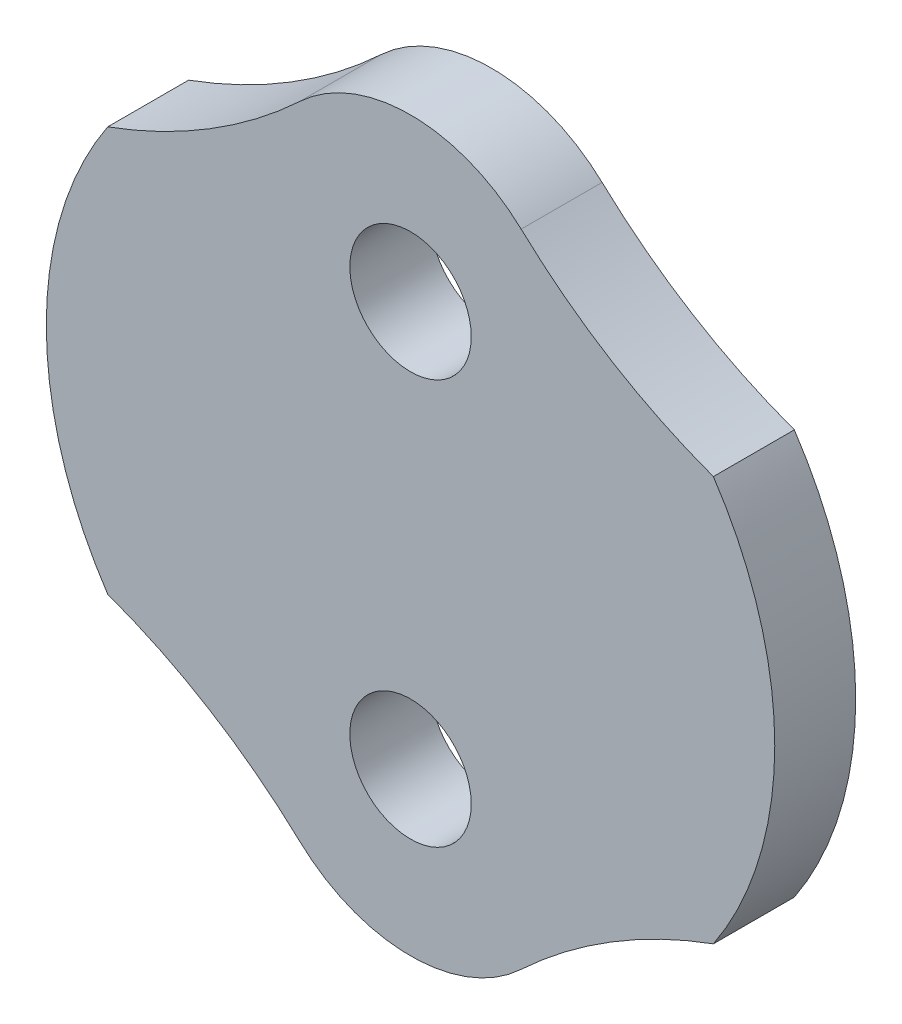
ISO-10303-21;
HEADER;
FILE_DESCRIPTION(('STEP AP214'),'2;1');
FILE_NAME('part.step','',(''),(''),'','','');
FILE_SCHEMA(('AUTOMOTIVE_DESIGN { 1 0 10303 214 1 1 1 1 }'));
ENDSEC;
DATA;
#1=APPLICATION_CONTEXT('core data for automotive mechanical design processes');
#2=APPLICATION_PROTOCOL_DEFINITION('international standard','automotive_design',2000,#1);
#3=PRODUCT_CONTEXT('',#1,'mechanical');
#4=PRODUCT('Part','Part','',(#3));
#5=PRODUCT_RELATED_PRODUCT_CATEGORY('part','',(#4));
#6=PRODUCT_DEFINITION_FORMATION('','',#4);
#7=PRODUCT_DEFINITION_CONTEXT('part definition',#1,'design');
#8=PRODUCT_DEFINITION('design','',#6,#7);
#9=PRODUCT_DEFINITION_SHAPE('','',#8);
#10=(LENGTH_UNIT() NAMED_UNIT(*) SI_UNIT(.MILLI.,.METRE.));
#11=(NAMED_UNIT(*) PLANE_ANGLE_UNIT() SI_UNIT($,.RADIAN.));
#12=(NAMED_UNIT(*) SI_UNIT($,.STERADIAN.) SOLID_ANGLE_UNIT());
#13=UNCERTAINTY_MEASURE_WITH_UNIT(LENGTH_MEASURE(1.E-05),#10,'distance_accuracy_value','');
#14=(GEOMETRIC_REPRESENTATION_CONTEXT(3) GLOBAL_UNCERTAINTY_ASSIGNED_CONTEXT((#13)) GLOBAL_UNIT_ASSIGNED_CONTEXT((#10,
#11,#12)) REPRESENTATION_CONTEXT('',''));
#15=CARTESIAN_POINT('',(0.,0.,0.));
#16=DIRECTION('',(0.,0.,1.));
#17=DIRECTION('',(1.,0.,0.));
#18=AXIS2_PLACEMENT_3D('',#15,#16,#17);
#19=CARTESIAN_POINT('',(0.,0.,3.175));
#20=DIRECTION('',(0.,0.,1.));
#21=DIRECTION('',(1.,0.,0.));
#22=AXIS2_PLACEMENT_3D('',#19,#20,#21);
#23=PLANE('',#22);
#24=CARTESIAN_POINT('',(0.,-7.9375,3.175));
#25=DIRECTION('',(0.,0.,1.));
#26=DIRECTION('',(1.,0.,0.));
#27=AXIS2_PLACEMENT_3D('',#24,#25,#26);
#28=CIRCLE('',#27,2.38125);
#29=CARTESIAN_POINT('',(2.38125,-7.9375,3.175));
#30=VERTEX_POINT('',#29);
#31=EDGE_CURVE('E159',#30,#30,#28,.T.);
#32=ORIENTED_EDGE('',*,*,#31,.F.);
#33=EDGE_LOOP('',(#32));
#34=FACE_BOUND('',#33,.T.);
#35=CARTESIAN_POINT('',(0.,7.9375,3.175));
#36=DIRECTION('',(0.,0.,1.));
#37=DIRECTION('',(1.,0.,0.));
#38=AXIS2_PLACEMENT_3D('',#35,#36,#37);
#39=CIRCLE('',#38,2.38125);
#40=CARTESIAN_POINT('',(2.38125,7.9375,3.175));
#41=VERTEX_POINT('',#40);
#42=EDGE_CURVE('E165',#41,#41,#39,.T.);
#43=ORIENTED_EDGE('',*,*,#42,.F.);
#44=EDGE_LOOP('',(#43));
#45=FACE_BOUND('',#44,.T.);
#46=CARTESIAN_POINT('',(0.,0.,3.175));
#47=DIRECTION('',(0.,0.,1.));
#48=DIRECTION('',(1.,0.,0.));
#49=AXIS2_PLACEMENT_3D('',#46,#47,#48);
#50=CIRCLE('',#49,14.2875);
#51=CARTESIAN_POINT('',(-11.8797622030073,7.9375,3.175));
#52=VERTEX_POINT('',#51);
#53=CARTESIAN_POINT('',(-11.8797622030073,-7.9375,3.175));
#54=VERTEX_POINT('',#53);
#55=EDGE_CURVE('E11',#52,#54,#50,.T.);
#56=ORIENTED_EDGE('',*,*,#55,.T.);
#57=CARTESIAN_POINT('',(-19.4680635279513,-28.729992320742,3.175));
#58=DIRECTION('',(0.,0.,1.));
#59=DIRECTION('',(1.,0.,0.));
#60=AXIS2_PLACEMENT_3D('',#57,#58,#59);
#61=CIRCLE('',#60,22.1339118527716);
#62=CARTESIAN_POINT('',(-4.34007112651774,-12.5728298282611,3.175));
#63=VERTEX_POINT('',#62);
#64=EDGE_CURVE('E125',#54,#63,#61,.F.);
#65=ORIENTED_EDGE('',*,*,#64,.T.);
#66=CARTESIAN_POINT('',(0.,-7.9375,3.175));
#67=DIRECTION('',(0.,0.,1.));
#68=DIRECTION('',(1.,0.,0.));
#69=AXIS2_PLACEMENT_3D('',#66,#67,#68);
#70=CIRCLE('',#69,6.35);
#71=CARTESIAN_POINT('',(4.34007112651774,-12.5728298282611,3.175));
#72=VERTEX_POINT('',#71);
#73=EDGE_CURVE('E139',#63,#72,#70,.T.);
#74=ORIENTED_EDGE('',*,*,#73,.T.);
#75=CARTESIAN_POINT('',(19.4680635279513,-28.729992320742,3.175));
#76=DIRECTION('',(0.,0.,1.));
#77=DIRECTION('',(1.,0.,0.));
#78=AXIS2_PLACEMENT_3D('',#75,#76,#77);
#79=CIRCLE('',#78,22.1339118527716);
#80=CARTESIAN_POINT('',(11.8797622030073,-7.9375,3.175));
#81=VERTEX_POINT('',#80);
#82=EDGE_CURVE('E136',#81,#72,#79,.T.);
#83=ORIENTED_EDGE('',*,*,#82,.F.);
#84=CARTESIAN_POINT('',(11.8797622030073,7.93750000000001,3.175));
#85=VERTEX_POINT('',#84);
#86=EDGE_CURVE('E42',#81,#85,#50,.T.);
#87=ORIENTED_EDGE('',*,*,#86,.T.);
#88=CARTESIAN_POINT('',(19.4680635279513,28.729992320742,3.175));
#89=DIRECTION('',(0.,0.,1.));
#90=DIRECTION('',(1.,0.,0.));
#91=AXIS2_PLACEMENT_3D('',#88,#89,#90);
#92=CIRCLE('',#91,22.1339118527716);
#93=CARTESIAN_POINT('',(4.34007112651775,12.5728298282611,3.175));
#94=VERTEX_POINT('',#93);
#95=EDGE_CURVE('E57',#85,#94,#92,.F.);
#96=ORIENTED_EDGE('',*,*,#95,.T.);
#97=CARTESIAN_POINT('',(0.,7.9375,3.175));
#98=DIRECTION('',(0.,0.,1.));
#99=DIRECTION('',(1.,0.,0.));
#100=AXIS2_PLACEMENT_3D('',#97,#98,#99);
#101=CIRCLE('',#100,6.35);
#102=CARTESIAN_POINT('',(-4.34007112651775,12.5728298282611,3.175));
#103=VERTEX_POINT('',#102);
#104=EDGE_CURVE('E114',#94,#103,#101,.T.);
#105=ORIENTED_EDGE('',*,*,#104,.T.);
#106=CARTESIAN_POINT('',(-19.4680635279513,28.729992320742,3.175));
#107=DIRECTION('',(0.,0.,1.));
#108=DIRECTION('',(1.,0.,0.));
#109=AXIS2_PLACEMENT_3D('',#106,#107,#108);
#110=CIRCLE('',#109,22.1339118527716);
#111=EDGE_CURVE('E122',#52,#103,#110,.T.);
#112=ORIENTED_EDGE('',*,*,#111,.F.);
#113=EDGE_LOOP('',(#56,#65,#74,#83,#87,#96,#105,#112));
#114=FACE_BOUND('',#113,.T.);
#115=ADVANCED_FACE('F33',(#34,#45,#114),#23,.T.);
#116=CARTESIAN_POINT('',(0.,0.,0.));
#117=DIRECTION('',(0.,0.,1.));
#118=DIRECTION('',(1.,0.,0.));
#119=AXIS2_PLACEMENT_3D('',#116,#117,#118);
#120=PLANE('',#119);
#121=CARTESIAN_POINT('',(-19.4680635279513,-28.729992320742,0.));
#122=DIRECTION('',(0.,0.,1.));
#123=DIRECTION('',(1.,0.,0.));
#124=AXIS2_PLACEMENT_3D('',#121,#122,#123);
#125=CIRCLE('',#124,22.1339118527716);
#126=CARTESIAN_POINT('',(-11.8797622030073,-7.9375,0.));
#127=VERTEX_POINT('',#126);
#128=CARTESIAN_POINT('',(-4.34007112651774,-12.5728298282611,0.));
#129=VERTEX_POINT('',#128);
#130=EDGE_CURVE('E131',#127,#129,#125,.F.);
#131=ORIENTED_EDGE('',*,*,#130,.F.);
#132=CARTESIAN_POINT('',(0.,0.,0.));
#133=DIRECTION('',(0.,0.,1.));
#134=DIRECTION('',(1.,0.,0.));
#135=AXIS2_PLACEMENT_3D('',#132,#133,#134);
#136=CIRCLE('',#135,14.2875);
#137=CARTESIAN_POINT('',(-11.8797622030073,7.9375,0.));
#138=VERTEX_POINT('',#137);
#139=EDGE_CURVE('E170',#138,#127,#136,.T.);
#140=ORIENTED_EDGE('',*,*,#139,.F.);
#141=CARTESIAN_POINT('',(-19.4680635279513,28.729992320742,0.));
#142=DIRECTION('',(0.,0.,1.));
#143=DIRECTION('',(1.,0.,0.));
#144=AXIS2_PLACEMENT_3D('',#141,#142,#143);
#145=CIRCLE('',#144,22.1339118527716);
#146=CARTESIAN_POINT('',(-4.34007112651775,12.5728298282611,0.));
#147=VERTEX_POINT('',#146);
#148=EDGE_CURVE('E115',#138,#147,#145,.T.);
#149=ORIENTED_EDGE('',*,*,#148,.T.);
#150=CARTESIAN_POINT('',(0.,7.9375,0.));
#151=DIRECTION('',(0.,0.,1.));
#152=DIRECTION('',(1.,0.,0.));
#153=AXIS2_PLACEMENT_3D('',#150,#151,#152);
#154=CIRCLE('',#153,6.35);
#155=CARTESIAN_POINT('',(4.34007112651775,12.5728298282611,0.));
#156=VERTEX_POINT('',#155);
#157=EDGE_CURVE('E108',#156,#147,#154,.T.);
#158=ORIENTED_EDGE('',*,*,#157,.F.);
#159=CARTESIAN_POINT('',(19.4680635279513,28.729992320742,0.));
#160=DIRECTION('',(0.,0.,1.));
#161=DIRECTION('',(1.,0.,0.));
#162=AXIS2_PLACEMENT_3D('',#159,#160,#161);
#163=CIRCLE('',#162,22.1339118527716);
#164=CARTESIAN_POINT('',(11.8797622030073,7.9375,0.));
#165=VERTEX_POINT('',#164);
#166=EDGE_CURVE('E98',#165,#156,#163,.F.);
#167=ORIENTED_EDGE('',*,*,#166,.F.);
#168=CARTESIAN_POINT('',(11.8797622030073,-7.93750000000001,0.));
#169=VERTEX_POINT('',#168);
#170=EDGE_CURVE('E37',#169,#165,#136,.T.);
#171=ORIENTED_EDGE('',*,*,#170,.F.);
#172=CARTESIAN_POINT('',(19.4680635279513,-28.729992320742,0.));
#173=DIRECTION('',(0.,0.,1.));
#174=DIRECTION('',(1.,0.,0.));
#175=AXIS2_PLACEMENT_3D('',#172,#173,#174);
#176=CIRCLE('',#175,22.1339118527716);
#177=CARTESIAN_POINT('',(4.34007112651774,-12.5728298282611,0.));
#178=VERTEX_POINT('',#177);
#179=EDGE_CURVE('E49',#169,#178,#176,.T.);
#180=ORIENTED_EDGE('',*,*,#179,.T.);
#181=CARTESIAN_POINT('',(0.,-7.9375,0.));
#182=DIRECTION('',(0.,0.,1.));
#183=DIRECTION('',(1.,0.,0.));
#184=AXIS2_PLACEMENT_3D('',#181,#182,#183);
#185=CIRCLE('',#184,6.35);
#186=EDGE_CURVE('E129',#129,#178,#185,.T.);
#187=ORIENTED_EDGE('',*,*,#186,.F.);
#188=EDGE_LOOP('',(#131,#140,#149,#158,#167,#171,#180,#187));
#189=FACE_BOUND('',#188,.T.);
#190=CARTESIAN_POINT('',(0.,7.9375,0.));
#191=DIRECTION('',(0.,0.,1.));
#192=DIRECTION('',(1.,0.,0.));
#193=AXIS2_PLACEMENT_3D('',#190,#191,#192);
#194=CIRCLE('',#193,2.38125);
#195=CARTESIAN_POINT('',(2.38125,7.9375,0.));
#196=VERTEX_POINT('',#195);
#197=EDGE_CURVE('E162',#196,#196,#194,.T.);
#198=ORIENTED_EDGE('',*,*,#197,.T.);
#199=EDGE_LOOP('',(#198));
#200=FACE_BOUND('',#199,.T.);
#201=CARTESIAN_POINT('',(0.,-7.9375,0.));
#202=DIRECTION('',(0.,0.,1.));
#203=DIRECTION('',(1.,0.,0.));
#204=AXIS2_PLACEMENT_3D('',#201,#202,#203);
#205=CIRCLE('',#204,2.38125);
#206=CARTESIAN_POINT('',(2.38125,-7.9375,0.));
#207=VERTEX_POINT('',#206);
#208=EDGE_CURVE('E145',#207,#207,#205,.T.);
#209=ORIENTED_EDGE('',*,*,#208,.T.);
#210=EDGE_LOOP('',(#209));
#211=FACE_BOUND('',#210,.T.);
#212=ADVANCED_FACE('F119',(#189,#200,#211),#120,.F.);
#213=CARTESIAN_POINT('',(0.,0.,3.175));
#214=DIRECTION('',(0.,0.,-1.));
#215=DIRECTION('',(-1.,0.,0.));
#216=AXIS2_PLACEMENT_3D('',#213,#214,#215);
#217=CYLINDRICAL_SURFACE('',#216,14.2875);
#218=ORIENTED_EDGE('',*,*,#55,.F.);
#219=DIRECTION('',(0.,0.,1.));
#220=VECTOR('',#219,1.);
#221=CARTESIAN_POINT('',(-11.8797622030073,7.9375,0.));
#222=LINE('',#221,#220);
#223=EDGE_CURVE('E146',#138,#52,#222,.T.);
#224=ORIENTED_EDGE('',*,*,#223,.F.);
#225=ORIENTED_EDGE('',*,*,#139,.T.);
#226=DIRECTION('',(0.,0.,1.));
#227=VECTOR('',#226,1.);
#228=CARTESIAN_POINT('',(-11.8797622030073,-7.9375,0.));
#229=LINE('',#228,#227);
#230=EDGE_CURVE('E148',#127,#54,#229,.T.);
#231=ORIENTED_EDGE('',*,*,#230,.T.);
#232=EDGE_LOOP('',(#218,#224,#225,#231));
#233=FACE_BOUND('',#232,.T.);
#234=ADVANCED_FACE('F188',(#233),#217,.T.);
#235=ORIENTED_EDGE('',*,*,#86,.F.);
#236=DIRECTION('',(0.,0.,1.));
#237=VECTOR('',#236,1.);
#238=CARTESIAN_POINT('',(11.8797622030073,-7.9375,0.));
#239=LINE('',#238,#237);
#240=EDGE_CURVE('E156',#169,#81,#239,.T.);
#241=ORIENTED_EDGE('',*,*,#240,.F.);
#242=ORIENTED_EDGE('',*,*,#170,.T.);
#243=DIRECTION('',(0.,0.,1.));
#244=VECTOR('',#243,1.);
#245=CARTESIAN_POINT('',(11.8797622030073,7.9375,0.));
#246=LINE('',#245,#244);
#247=EDGE_CURVE('E103',#165,#85,#246,.T.);
#248=ORIENTED_EDGE('',*,*,#247,.T.);
#249=EDGE_LOOP('',(#235,#241,#242,#248));
#250=FACE_BOUND('',#249,.T.);
#251=ADVANCED_FACE('F35',(#250),#217,.T.);
#252=CARTESIAN_POINT('',(0.,7.9375,3.175));
#253=DIRECTION('',(0.,0.,-1.));
#254=DIRECTION('',(-1.,0.,0.));
#255=AXIS2_PLACEMENT_3D('',#252,#253,#254);
#256=CYLINDRICAL_SURFACE('',#255,2.38125);
#257=ORIENTED_EDGE('',*,*,#42,.T.);
#258=EDGE_LOOP('',(#257));
#259=FACE_BOUND('',#258,.T.);
#260=ORIENTED_EDGE('',*,*,#197,.F.);
#261=EDGE_LOOP('',(#260));
#262=FACE_BOUND('',#261,.T.);
#263=ADVANCED_FACE('F211',(#259,#262),#256,.F.);
#264=CARTESIAN_POINT('',(0.,-7.9375,3.175));
#265=DIRECTION('',(0.,0.,-1.));
#266=DIRECTION('',(-1.,0.,0.));
#267=AXIS2_PLACEMENT_3D('',#264,#265,#266);
#268=CYLINDRICAL_SURFACE('',#267,2.38125);
#269=ORIENTED_EDGE('',*,*,#31,.T.);
#270=EDGE_LOOP('',(#269));
#271=FACE_BOUND('',#270,.T.);
#272=ORIENTED_EDGE('',*,*,#208,.F.);
#273=EDGE_LOOP('',(#272));
#274=FACE_BOUND('',#273,.T.);
#275=ADVANCED_FACE('F198',(#271,#274),#268,.F.);
#276=CARTESIAN_POINT('',(19.4680635279513,28.729992320742,0.));
#277=DIRECTION('',(0.,0.,1.));
#278=DIRECTION('',(1.,0.,0.));
#279=AXIS2_PLACEMENT_3D('',#276,#277,#278);
#280=CYLINDRICAL_SURFACE('',#279,22.1339118527716);
#281=ORIENTED_EDGE('',*,*,#95,.F.);
#282=ORIENTED_EDGE('',*,*,#247,.F.);
#283=ORIENTED_EDGE('',*,*,#166,.T.);
#284=DIRECTION('',(0.,0.,1.));
#285=VECTOR('',#284,1.);
#286=CARTESIAN_POINT('',(4.34007112651775,12.5728298282611,0.));
#287=LINE('',#286,#285);
#288=EDGE_CURVE('E101',#156,#94,#287,.T.);
#289=ORIENTED_EDGE('',*,*,#288,.T.);
#290=EDGE_LOOP('',(#281,#282,#283,#289));
#291=FACE_BOUND('',#290,.T.);
#292=ADVANCED_FACE('F100',(#291),#280,.F.);
#293=CARTESIAN_POINT('',(-19.4680635279513,28.729992320742,0.));
#294=DIRECTION('',(0.,0.,1.));
#295=DIRECTION('',(1.,0.,0.));
#296=AXIS2_PLACEMENT_3D('',#293,#294,#295);
#297=CYLINDRICAL_SURFACE('',#296,22.1339118527716);
#298=ORIENTED_EDGE('',*,*,#111,.T.);
#299=DIRECTION('',(0.,0.,1.));
#300=VECTOR('',#299,1.);
#301=CARTESIAN_POINT('',(-4.34007112651775,12.5728298282611,0.));
#302=LINE('',#301,#300);
#303=EDGE_CURVE('E143',#147,#103,#302,.T.);
#304=ORIENTED_EDGE('',*,*,#303,.F.);
#305=ORIENTED_EDGE('',*,*,#148,.F.);
#306=ORIENTED_EDGE('',*,*,#223,.T.);
#307=EDGE_LOOP('',(#298,#304,#305,#306));
#308=FACE_BOUND('',#307,.T.);
#309=ADVANCED_FACE('F190',(#308),#297,.F.);
#310=CARTESIAN_POINT('',(0.,7.9375,0.));
#311=DIRECTION('',(0.,0.,1.));
#312=DIRECTION('',(1.,0.,0.));
#313=AXIS2_PLACEMENT_3D('',#310,#311,#312);
#314=CYLINDRICAL_SURFACE('',#313,6.35);
#315=ORIENTED_EDGE('',*,*,#157,.T.);
#316=ORIENTED_EDGE('',*,*,#303,.T.);
#317=ORIENTED_EDGE('',*,*,#104,.F.);
#318=ORIENTED_EDGE('',*,*,#288,.F.);
#319=EDGE_LOOP('',(#315,#316,#317,#318));
#320=FACE_BOUND('',#319,.T.);
#321=ADVANCED_FACE('F111',(#320),#314,.T.);
#322=CARTESIAN_POINT('',(0.,-7.9375,0.));
#323=DIRECTION('',(0.,0.,1.));
#324=DIRECTION('',(1.,0.,0.));
#325=AXIS2_PLACEMENT_3D('',#322,#323,#324);
#326=CYLINDRICAL_SURFACE('',#325,6.35);
#327=ORIENTED_EDGE('',*,*,#186,.T.);
#328=DIRECTION('',(0.,0.,1.));
#329=VECTOR('',#328,1.);
#330=CARTESIAN_POINT('',(4.34007112651774,-12.5728298282611,0.));
#331=LINE('',#330,#329);
#332=EDGE_CURVE('E153',#178,#72,#331,.T.);
#333=ORIENTED_EDGE('',*,*,#332,.T.);
#334=ORIENTED_EDGE('',*,*,#73,.F.);
#335=DIRECTION('',(0.,0.,1.));
#336=VECTOR('',#335,1.);
#337=CARTESIAN_POINT('',(-4.34007112651774,-12.5728298282611,0.));
#338=LINE('',#337,#336);
#339=EDGE_CURVE('E151',#129,#63,#338,.T.);
#340=ORIENTED_EDGE('',*,*,#339,.F.);
#341=EDGE_LOOP('',(#327,#333,#334,#340));
#342=FACE_BOUND('',#341,.T.);
#343=ADVANCED_FACE('F181',(#342),#326,.T.);
#344=CARTESIAN_POINT('',(-19.4680635279513,-28.729992320742,0.));
#345=DIRECTION('',(0.,0.,1.));
#346=DIRECTION('',(1.,0.,0.));
#347=AXIS2_PLACEMENT_3D('',#344,#345,#346);
#348=CYLINDRICAL_SURFACE('',#347,22.1339118527716);
#349=ORIENTED_EDGE('',*,*,#64,.F.);
#350=ORIENTED_EDGE('',*,*,#230,.F.);
#351=ORIENTED_EDGE('',*,*,#130,.T.);
#352=ORIENTED_EDGE('',*,*,#339,.T.);
#353=EDGE_LOOP('',(#349,#350,#351,#352));
#354=FACE_BOUND('',#353,.T.);
#355=ADVANCED_FACE('F187',(#354),#348,.F.);
#356=CARTESIAN_POINT('',(19.4680635279513,-28.729992320742,0.));
#357=DIRECTION('',(0.,0.,1.));
#358=DIRECTION('',(1.,0.,0.));
#359=AXIS2_PLACEMENT_3D('',#356,#357,#358);
#360=CYLINDRICAL_SURFACE('',#359,22.1339118527716);
#361=ORIENTED_EDGE('',*,*,#82,.T.);
#362=ORIENTED_EDGE('',*,*,#332,.F.);
#363=ORIENTED_EDGE('',*,*,#179,.F.);
#364=ORIENTED_EDGE('',*,*,#240,.T.);
#365=EDGE_LOOP('',(#361,#362,#363,#364));
#366=FACE_BOUND('',#365,.T.);
#367=ADVANCED_FACE('F183',(#366),#360,.F.);
#368=CLOSED_SHELL('',(#115,#212,#234,#251,#263,#275,#292,#309,#321,#343,#355,#367));
#369=MANIFOLD_SOLID_BREP('B2',#368);
#370=ADVANCED_BREP_SHAPE_REPRESENTATION('',(#18,#369),#14);
#371=SHAPE_DEFINITION_REPRESENTATION(#9,#370);
ENDSEC;
END-ISO-10303-21;
